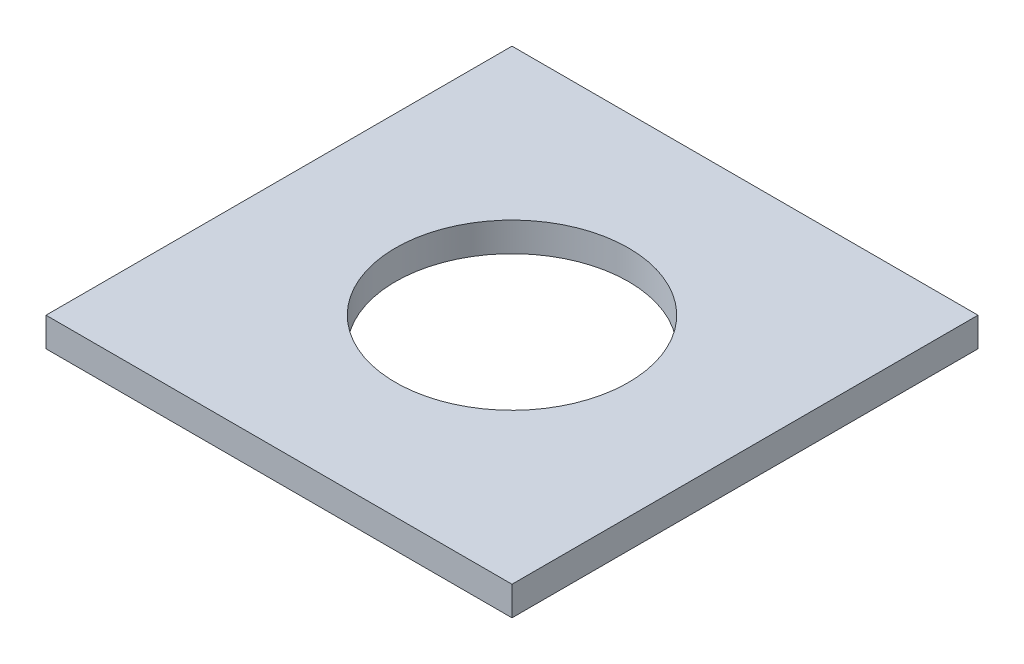
ISO-10303-21;
HEADER;
FILE_DESCRIPTION(('STEP AP214'),'2;1');
FILE_NAME('part.step','',(''),(''),'','','');
FILE_SCHEMA(('AUTOMOTIVE_DESIGN { 1 0 10303 214 1 1 1 1 }'));
ENDSEC;
DATA;
#1=APPLICATION_CONTEXT('core data for automotive mechanical design processes');
#2=APPLICATION_PROTOCOL_DEFINITION('international standard','automotive_design',2000,#1);
#3=PRODUCT_CONTEXT('',#1,'mechanical');
#4=PRODUCT('Part','Part','',(#3));
#5=PRODUCT_RELATED_PRODUCT_CATEGORY('part','',(#4));
#6=PRODUCT_DEFINITION_FORMATION('','',#4);
#7=PRODUCT_DEFINITION_CONTEXT('part definition',#1,'design');
#8=PRODUCT_DEFINITION('design','',#6,#7);
#9=PRODUCT_DEFINITION_SHAPE('','',#8);
#10=(LENGTH_UNIT() NAMED_UNIT(*) SI_UNIT(.MILLI.,.METRE.));
#11=(NAMED_UNIT(*) PLANE_ANGLE_UNIT() SI_UNIT($,.RADIAN.));
#12=(NAMED_UNIT(*) SI_UNIT($,.STERADIAN.) SOLID_ANGLE_UNIT());
#13=UNCERTAINTY_MEASURE_WITH_UNIT(LENGTH_MEASURE(1.E-05),#10,'distance_accuracy_value','');
#14=(GEOMETRIC_REPRESENTATION_CONTEXT(3) GLOBAL_UNCERTAINTY_ASSIGNED_CONTEXT((#13)) GLOBAL_UNIT_ASSIGNED_CONTEXT((#10,
#11,#12)) REPRESENTATION_CONTEXT('',''));
#15=CARTESIAN_POINT('',(0.,0.,0.));
#16=DIRECTION('',(0.,0.,1.));
#17=DIRECTION('',(1.,0.,0.));
#18=AXIS2_PLACEMENT_3D('',#15,#16,#17);
#19=CARTESIAN_POINT('',(0.,9.525,0.));
#20=DIRECTION('',(0.,-1.,0.));
#21=DIRECTION('',(0.,0.,-1.));
#22=AXIS2_PLACEMENT_3D('',#19,#20,#21);
#23=PLANE('',#22);
#24=DIRECTION('',(0.,0.,-1.));
#25=VECTOR('',#24,1.);
#26=CARTESIAN_POINT('',(76.2,9.525,76.2));
#27=LINE('',#26,#25);
#28=CARTESIAN_POINT('',(76.2,9.525,76.2));
#29=VERTEX_POINT('',#28);
#30=CARTESIAN_POINT('',(76.2,9.525,-76.2));
#31=VERTEX_POINT('',#30);
#32=EDGE_CURVE('E92',#29,#31,#27,.T.);
#33=ORIENTED_EDGE('',*,*,#32,.T.);
#34=DIRECTION('',(-1.,0.,0.));
#35=VECTOR('',#34,1.);
#36=CARTESIAN_POINT('',(-76.2,9.525,-76.2));
#37=LINE('',#36,#35);
#38=CARTESIAN_POINT('',(-76.2,9.525,-76.2));
#39=VERTEX_POINT('',#38);
#40=EDGE_CURVE('E87',#31,#39,#37,.T.);
#41=ORIENTED_EDGE('',*,*,#40,.T.);
#42=DIRECTION('',(0.,0.,1.));
#43=VECTOR('',#42,1.);
#44=CARTESIAN_POINT('',(-76.2,9.525,76.2));
#45=LINE('',#44,#43);
#46=CARTESIAN_POINT('',(-76.2,9.525,76.2));
#47=VERTEX_POINT('',#46);
#48=EDGE_CURVE('E90',#39,#47,#45,.T.);
#49=ORIENTED_EDGE('',*,*,#48,.T.);
#50=DIRECTION('',(1.,0.,0.));
#51=VECTOR('',#50,1.);
#52=CARTESIAN_POINT('',(-76.2,9.525,76.2));
#53=LINE('',#52,#51);
#54=EDGE_CURVE('E57',#47,#29,#53,.T.);
#55=ORIENTED_EDGE('',*,*,#54,.T.);
#56=EDGE_LOOP('',(#33,#41,#49,#55));
#57=FACE_BOUND('',#56,.T.);
#58=CARTESIAN_POINT('',(0.,9.525,0.));
#59=DIRECTION('',(0.,1.,0.));
#60=DIRECTION('',(0.,0.,1.));
#61=AXIS2_PLACEMENT_3D('',#58,#59,#60);
#62=CIRCLE('',#61,38.1);
#63=CARTESIAN_POINT('',(0.,9.525,-38.1));
#64=VERTEX_POINT('',#63);
#65=EDGE_CURVE('E112',#64,#64,#62,.T.);
#66=ORIENTED_EDGE('',*,*,#65,.F.);
#67=EDGE_LOOP('',(#66));
#68=FACE_BOUND('',#67,.T.);
#69=ADVANCED_FACE('F39',(#57,#68),#23,.F.);
#70=CARTESIAN_POINT('',(0.,0.,0.));
#71=DIRECTION('',(0.,-1.,0.));
#72=DIRECTION('',(0.,0.,-1.));
#73=AXIS2_PLACEMENT_3D('',#70,#71,#72);
#74=PLANE('',#73);
#75=DIRECTION('',(0.,0.,-1.));
#76=VECTOR('',#75,1.);
#77=CARTESIAN_POINT('',(76.2,0.,76.2));
#78=LINE('',#77,#76);
#79=CARTESIAN_POINT('',(76.2,0.,76.2));
#80=VERTEX_POINT('',#79);
#81=CARTESIAN_POINT('',(76.2,0.,-76.2));
#82=VERTEX_POINT('',#81);
#83=EDGE_CURVE('E108',#80,#82,#78,.T.);
#84=ORIENTED_EDGE('',*,*,#83,.F.);
#85=DIRECTION('',(1.,0.,0.));
#86=VECTOR('',#85,1.);
#87=CARTESIAN_POINT('',(-76.2,0.,76.2));
#88=LINE('',#87,#86);
#89=CARTESIAN_POINT('',(-76.2,0.,76.2));
#90=VERTEX_POINT('',#89);
#91=EDGE_CURVE('E80',#90,#80,#88,.T.);
#92=ORIENTED_EDGE('',*,*,#91,.F.);
#93=DIRECTION('',(0.,0.,1.));
#94=VECTOR('',#93,1.);
#95=CARTESIAN_POINT('',(-76.2,0.,76.2));
#96=LINE('',#95,#94);
#97=CARTESIAN_POINT('',(-76.2,0.,-76.2));
#98=VERTEX_POINT('',#97);
#99=EDGE_CURVE('E74',#98,#90,#96,.T.);
#100=ORIENTED_EDGE('',*,*,#99,.F.);
#101=DIRECTION('',(-1.,0.,0.));
#102=VECTOR('',#101,1.);
#103=CARTESIAN_POINT('',(-76.2,0.,-76.2));
#104=LINE('',#103,#102);
#105=EDGE_CURVE('E97',#82,#98,#104,.T.);
#106=ORIENTED_EDGE('',*,*,#105,.F.);
#107=EDGE_LOOP('',(#84,#92,#100,#106));
#108=FACE_BOUND('',#107,.T.);
#109=CARTESIAN_POINT('',(0.,0.,0.));
#110=DIRECTION('',(0.,1.,0.));
#111=DIRECTION('',(0.,0.,1.));
#112=AXIS2_PLACEMENT_3D('',#109,#110,#111);
#113=CIRCLE('',#112,38.1);
#114=CARTESIAN_POINT('',(0.,0.,-38.1));
#115=VERTEX_POINT('',#114);
#116=EDGE_CURVE('E130',#115,#115,#113,.T.);
#117=ORIENTED_EDGE('',*,*,#116,.T.);
#118=EDGE_LOOP('',(#117));
#119=FACE_BOUND('',#118,.T.);
#120=ADVANCED_FACE('F125',(#108,#119),#74,.T.);
#121=CARTESIAN_POINT('',(76.2,9.525,76.2));
#122=DIRECTION('',(-1.,0.,0.));
#123=DIRECTION('',(0.,0.,1.));
#124=AXIS2_PLACEMENT_3D('',#121,#122,#123);
#125=PLANE('',#124);
#126=ORIENTED_EDGE('',*,*,#83,.T.);
#127=DIRECTION('',(0.,-1.,0.));
#128=VECTOR('',#127,1.);
#129=CARTESIAN_POINT('',(76.2,9.525,-76.2));
#130=LINE('',#129,#128);
#131=EDGE_CURVE('E11',#31,#82,#130,.T.);
#132=ORIENTED_EDGE('',*,*,#131,.F.);
#133=ORIENTED_EDGE('',*,*,#32,.F.);
#134=DIRECTION('',(0.,-1.,0.));
#135=VECTOR('',#134,1.);
#136=CARTESIAN_POINT('',(76.2,9.525,76.2));
#137=LINE('',#136,#135);
#138=EDGE_CURVE('E104',#29,#80,#137,.T.);
#139=ORIENTED_EDGE('',*,*,#138,.T.);
#140=EDGE_LOOP('',(#126,#132,#133,#139));
#141=FACE_BOUND('',#140,.T.);
#142=ADVANCED_FACE('F41',(#141),#125,.F.);
#143=CARTESIAN_POINT('',(-76.2,9.525,-76.2));
#144=DIRECTION('',(0.,0.,1.));
#145=DIRECTION('',(1.,0.,0.));
#146=AXIS2_PLACEMENT_3D('',#143,#144,#145);
#147=PLANE('',#146);
#148=ORIENTED_EDGE('',*,*,#105,.T.);
#149=DIRECTION('',(0.,-1.,0.));
#150=VECTOR('',#149,1.);
#151=CARTESIAN_POINT('',(-76.2,9.525,-76.2));
#152=LINE('',#151,#150);
#153=EDGE_CURVE('E49',#39,#98,#152,.T.);
#154=ORIENTED_EDGE('',*,*,#153,.F.);
#155=ORIENTED_EDGE('',*,*,#40,.F.);
#156=ORIENTED_EDGE('',*,*,#131,.T.);
#157=EDGE_LOOP('',(#148,#154,#155,#156));
#158=FACE_BOUND('',#157,.T.);
#159=ADVANCED_FACE('F96',(#158),#147,.F.);
#160=CARTESIAN_POINT('',(-76.2,9.525,76.2));
#161=DIRECTION('',(1.,0.,0.));
#162=DIRECTION('',(0.,0.,-1.));
#163=AXIS2_PLACEMENT_3D('',#160,#161,#162);
#164=PLANE('',#163);
#165=ORIENTED_EDGE('',*,*,#99,.T.);
#166=DIRECTION('',(0.,-1.,0.));
#167=VECTOR('',#166,1.);
#168=CARTESIAN_POINT('',(-76.2,9.525,76.2));
#169=LINE('',#168,#167);
#170=EDGE_CURVE('E99',#47,#90,#169,.T.);
#171=ORIENTED_EDGE('',*,*,#170,.F.);
#172=ORIENTED_EDGE('',*,*,#48,.F.);
#173=ORIENTED_EDGE('',*,*,#153,.T.);
#174=EDGE_LOOP('',(#165,#171,#172,#173));
#175=FACE_BOUND('',#174,.T.);
#176=ADVANCED_FACE('F100',(#175),#164,.F.);
#177=CARTESIAN_POINT('',(-76.2,9.525,76.2));
#178=DIRECTION('',(0.,0.,-1.));
#179=DIRECTION('',(-1.,0.,0.));
#180=AXIS2_PLACEMENT_3D('',#177,#178,#179);
#181=PLANE('',#180);
#182=ORIENTED_EDGE('',*,*,#91,.T.);
#183=ORIENTED_EDGE('',*,*,#138,.F.);
#184=ORIENTED_EDGE('',*,*,#54,.F.);
#185=ORIENTED_EDGE('',*,*,#170,.T.);
#186=EDGE_LOOP('',(#182,#183,#184,#185));
#187=FACE_BOUND('',#186,.T.);
#188=ADVANCED_FACE('F122',(#187),#181,.F.);
#189=CARTESIAN_POINT('',(0.,9.525,0.));
#190=DIRECTION('',(0.,-1.,0.));
#191=DIRECTION('',(0.,0.,-1.));
#192=AXIS2_PLACEMENT_3D('',#189,#190,#191);
#193=CYLINDRICAL_SURFACE('',#192,38.1);
#194=CARTESIAN_POINT('',(0.,9.525,-38.1));
#195=CARTESIAN_POINT('',(0.,9.42578125,-38.1));
#196=CARTESIAN_POINT('',(0.,9.3265625,-38.1));
#197=CARTESIAN_POINT('',(0.,9.128125,-38.1));
#198=CARTESIAN_POINT('',(0.,9.02890625,-38.1));
#199=CARTESIAN_POINT('',(0.,8.83046875,-38.1));
#200=CARTESIAN_POINT('',(0.,8.73125,-38.1));
#201=CARTESIAN_POINT('',(0.,8.5328125,-38.1));
#202=CARTESIAN_POINT('',(0.,8.43359375,-38.1));
#203=CARTESIAN_POINT('',(0.,8.23515625,-38.1));
#204=CARTESIAN_POINT('',(0.,8.1359375,-38.1));
#205=CARTESIAN_POINT('',(0.,7.9375,-38.1));
#206=CARTESIAN_POINT('',(0.,7.83828125,-38.1));
#207=CARTESIAN_POINT('',(0.,7.63984375,-38.1));
#208=CARTESIAN_POINT('',(0.,7.540625,-38.1));
#209=CARTESIAN_POINT('',(0.,7.3421875,-38.1));
#210=CARTESIAN_POINT('',(0.,7.24296875,-38.1));
#211=CARTESIAN_POINT('',(0.,7.04453125,-38.1));
#212=CARTESIAN_POINT('',(0.,6.9453125,-38.1));
#213=CARTESIAN_POINT('',(0.,6.746875,-38.1));
#214=CARTESIAN_POINT('',(0.,6.64765625,-38.1));
#215=CARTESIAN_POINT('',(0.,6.44921875,-38.1));
#216=CARTESIAN_POINT('',(0.,6.35,-38.1));
#217=CARTESIAN_POINT('',(0.,6.1515625,-38.1));
#218=CARTESIAN_POINT('',(0.,6.05234375,-38.1));
#219=CARTESIAN_POINT('',(0.,5.85390625,-38.1));
#220=CARTESIAN_POINT('',(0.,5.7546875,-38.1));
#221=CARTESIAN_POINT('',(0.,5.55625,-38.1));
#222=CARTESIAN_POINT('',(0.,5.45703125,-38.1));
#223=CARTESIAN_POINT('',(0.,5.25859375,-38.1));
#224=CARTESIAN_POINT('',(0.,5.159375,-38.1));
#225=CARTESIAN_POINT('',(0.,4.9609375,-38.1));
#226=CARTESIAN_POINT('',(0.,4.86171875,-38.1));
#227=CARTESIAN_POINT('',(0.,4.66328125,-38.1));
#228=CARTESIAN_POINT('',(0.,4.5640625,-38.1));
#229=CARTESIAN_POINT('',(0.,4.365625,-38.1));
#230=CARTESIAN_POINT('',(0.,4.26640625,-38.1));
#231=CARTESIAN_POINT('',(0.,4.06796875,-38.1));
#232=CARTESIAN_POINT('',(0.,3.96875,-38.1));
#233=CARTESIAN_POINT('',(0.,3.7703125,-38.1));
#234=CARTESIAN_POINT('',(0.,3.67109375,-38.1));
#235=CARTESIAN_POINT('',(0.,3.47265625,-38.1));
#236=CARTESIAN_POINT('',(0.,3.3734375,-38.1));
#237=CARTESIAN_POINT('',(0.,3.175,-38.1));
#238=CARTESIAN_POINT('',(0.,3.07578125,-38.1));
#239=CARTESIAN_POINT('',(0.,2.87734375,-38.1));
#240=CARTESIAN_POINT('',(0.,2.778125,-38.1));
#241=CARTESIAN_POINT('',(0.,2.5796875,-38.1));
#242=CARTESIAN_POINT('',(0.,2.48046875,-38.1));
#243=CARTESIAN_POINT('',(0.,2.28203125,-38.1));
#244=CARTESIAN_POINT('',(0.,2.1828125,-38.1));
#245=CARTESIAN_POINT('',(0.,1.984375,-38.1));
#246=CARTESIAN_POINT('',(0.,1.88515625,-38.1));
#247=CARTESIAN_POINT('',(0.,1.68671875,-38.1));
#248=CARTESIAN_POINT('',(0.,1.5875,-38.1));
#249=CARTESIAN_POINT('',(0.,1.3890625,-38.1));
#250=CARTESIAN_POINT('',(0.,1.28984375,-38.1));
#251=CARTESIAN_POINT('',(0.,1.09140625,-38.1));
#252=CARTESIAN_POINT('',(0.,0.992187500000001,-38.1));
#253=CARTESIAN_POINT('',(0.,0.793750000000001,-38.1));
#254=CARTESIAN_POINT('',(0.,0.69453125,-38.1));
#255=CARTESIAN_POINT('',(0.,0.49609375,-38.1));
#256=CARTESIAN_POINT('',(0.,0.396875,-38.1));
#257=CARTESIAN_POINT('',(0.,0.1984375,-38.1));
#258=CARTESIAN_POINT('',(0.,0.0992187500000001,-38.1));
#259=CARTESIAN_POINT('',(0.,0.,-38.1));
#260=B_SPLINE_CURVE_WITH_KNOTS('',3,(#194,#195,#196,#197,#198,#199,#200,#201,#202,#203,#204,
#205,#206,#207,#208,#209,#210,#211,#212,#213,#214,#215,#216,#217,#218,#219,#220,#221,#222,#223,
#224,#225,#226,#227,#228,#229,#230,#231,#232,#233,#234,#235,#236,#237,#238,#239,#240,#241,#242,
#243,#244,#245,#246,#247,#248,#249,#250,#251,#252,#253,#254,#255,#256,#257,#258,#259),
.UNSPECIFIED.,.F.,.F.,(4,2,2,2,2,2,2,2,2,2,2,2,2,2,2,2,2,2,2,2,2,2,2,2,2,2,2,2,2,2,2,2,4),(0.,
0.29765625,0.5953125,0.892968750000001,1.190625,1.48828125,1.7859375,2.08359375,2.38125,
2.67890625,2.9765625,3.27421875,3.571875,3.86953125,4.1671875,4.46484375,4.7625,5.06015625,
5.3578125,5.65546875,5.953125,6.25078125,6.5484375,6.84609375,7.14375,7.44140625,7.7390625,
8.03671875,8.334375,8.63203125,8.9296875,9.22734375,9.525),.UNSPECIFIED.);
#261=EDGE_CURVE('BSEAM138',#64,#115,#260,.T.);
#262=ORIENTED_EDGE('',*,*,#65,.T.);
#263=ORIENTED_EDGE('',*,*,#116,.F.);
#264=ORIENTED_EDGE('',*,*,#261,.T.);
#265=ORIENTED_EDGE('',*,*,#261,.F.);
#266=EDGE_LOOP('',(#262,#264,#263,#265));
#267=FACE_BOUND('',#266,.T.);
#268=ADVANCED_FACE('F138',(#267),#193,.F.);
#269=CLOSED_SHELL('',(#69,#120,#142,#159,#176,#188,#268));
#270=MANIFOLD_SOLID_BREP('B2',#269);
#271=ADVANCED_BREP_SHAPE_REPRESENTATION('',(#18,#270),#14);
#272=SHAPE_DEFINITION_REPRESENTATION(#9,#271);
ENDSEC;
END-ISO-10303-21;
